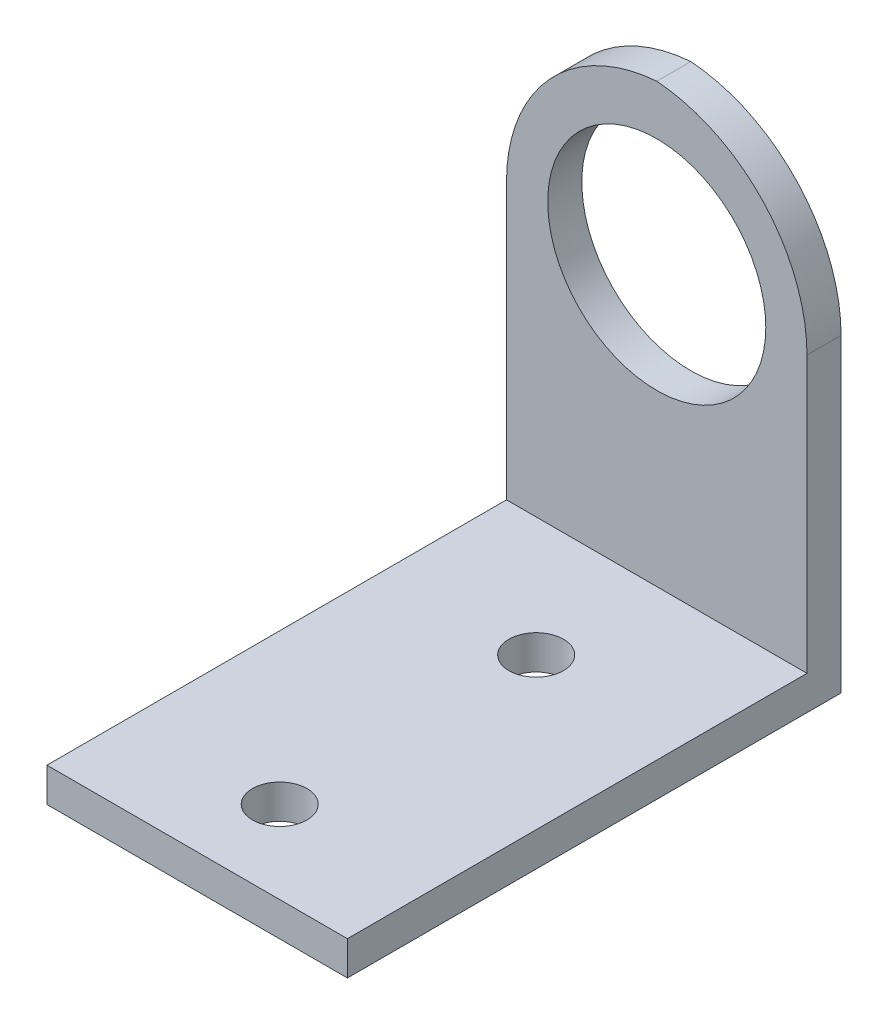
ISO-10303-21;
HEADER;
FILE_DESCRIPTION(('STEP AP214'),'2;1');
FILE_NAME('part.step','',(''),(''),'','','');
FILE_SCHEMA(('AUTOMOTIVE_DESIGN { 1 0 10303 214 1 1 1 1 }'));
ENDSEC;
DATA;
#1=APPLICATION_CONTEXT('core data for automotive mechanical design processes');
#2=APPLICATION_PROTOCOL_DEFINITION('international standard','automotive_design',2000,#1);
#3=PRODUCT_CONTEXT('',#1,'mechanical');
#4=PRODUCT('Part','Part','',(#3));
#5=PRODUCT_RELATED_PRODUCT_CATEGORY('part','',(#4));
#6=PRODUCT_DEFINITION_FORMATION('','',#4);
#7=PRODUCT_DEFINITION_CONTEXT('part definition',#1,'design');
#8=PRODUCT_DEFINITION('design','',#6,#7);
#9=PRODUCT_DEFINITION_SHAPE('','',#8);
#10=(LENGTH_UNIT() NAMED_UNIT(*) SI_UNIT(.MILLI.,.METRE.));
#11=(NAMED_UNIT(*) PLANE_ANGLE_UNIT() SI_UNIT($,.RADIAN.));
#12=(NAMED_UNIT(*) SI_UNIT($,.STERADIAN.) SOLID_ANGLE_UNIT());
#13=UNCERTAINTY_MEASURE_WITH_UNIT(LENGTH_MEASURE(1.E-05),#10,'distance_accuracy_value','');
#14=(GEOMETRIC_REPRESENTATION_CONTEXT(3) GLOBAL_UNCERTAINTY_ASSIGNED_CONTEXT((#13)) GLOBAL_UNIT_ASSIGNED_CONTEXT((#10,
#11,#12)) REPRESENTATION_CONTEXT('',''));
#15=CARTESIAN_POINT('',(0.,0.,0.));
#16=DIRECTION('',(0.,0.,1.));
#17=DIRECTION('',(1.,0.,0.));
#18=AXIS2_PLACEMENT_3D('',#15,#16,#17);
#19=CARTESIAN_POINT('',(-2.84600000000001,72.154,7.9375));
#20=DIRECTION('',(0.,0.,-1.));
#21=DIRECTION('',(-1.,0.,0.));
#22=AXIS2_PLACEMENT_3D('',#19,#20,#21);
#23=CYLINDRICAL_SURFACE('',#22,37.846);
#24=CARTESIAN_POINT('',(-2.84600000000001,72.154,0.));
#25=DIRECTION('',(0.,0.,1.));
#26=DIRECTION('',(1.,0.,0.));
#27=AXIS2_PLACEMENT_3D('',#24,#25,#26);
#28=CIRCLE('',#27,37.846);
#29=CARTESIAN_POINT('',(35.,72.154,0.));
#30=VERTEX_POINT('',#29);
#31=CARTESIAN_POINT('',(0.,109.892839409818,0.));
#32=VERTEX_POINT('',#31);
#33=EDGE_CURVE('E138',#30,#32,#28,.T.);
#34=ORIENTED_EDGE('',*,*,#33,.T.);
#35=DIRECTION('',(0.,0.,-1.));
#36=VECTOR('',#35,1.);
#37=CARTESIAN_POINT('',(0.,109.892839409818,7.9375));
#38=LINE('',#37,#36);
#39=CARTESIAN_POINT('',(0.,109.892839409818,7.9375));
#40=VERTEX_POINT('',#39);
#41=EDGE_CURVE('E11',#40,#32,#38,.T.);
#42=ORIENTED_EDGE('',*,*,#41,.F.);
#43=CARTESIAN_POINT('',(-2.84600000000001,72.154,7.9375));
#44=DIRECTION('',(0.,0.,1.));
#45=DIRECTION('',(1.,0.,0.));
#46=AXIS2_PLACEMENT_3D('',#43,#44,#45);
#47=CIRCLE('',#46,37.846);
#48=CARTESIAN_POINT('',(35.,72.154,7.9375));
#49=VERTEX_POINT('',#48);
#50=EDGE_CURVE('E127',#49,#40,#47,.T.);
#51=ORIENTED_EDGE('',*,*,#50,.F.);
#52=DIRECTION('',(0.,0.,-1.));
#53=VECTOR('',#52,1.);
#54=CARTESIAN_POINT('',(35.,72.154,7.9375));
#55=LINE('',#54,#53);
#56=EDGE_CURVE('E135',#49,#30,#55,.T.);
#57=ORIENTED_EDGE('',*,*,#56,.T.);
#58=EDGE_LOOP('',(#34,#42,#51,#57));
#59=FACE_BOUND('',#58,.T.);
#60=ADVANCED_FACE('F35',(#59),#23,.T.);
#61=CARTESIAN_POINT('',(2.84599999999999,72.1540000000001,7.9375));
#62=DIRECTION('',(0.,0.,-1.));
#63=DIRECTION('',(-1.,0.,0.));
#64=AXIS2_PLACEMENT_3D('',#61,#62,#63);
#65=CYLINDRICAL_SURFACE('',#64,37.846);
#66=CARTESIAN_POINT('',(2.84599999999999,72.1540000000001,0.));
#67=DIRECTION('',(0.,0.,1.));
#68=DIRECTION('',(1.,0.,0.));
#69=AXIS2_PLACEMENT_3D('',#66,#67,#68);
#70=CIRCLE('',#69,37.846);
#71=CARTESIAN_POINT('',(-35.,72.1540000000001,0.));
#72=VERTEX_POINT('',#71);
#73=EDGE_CURVE('E141',#32,#72,#70,.T.);
#74=ORIENTED_EDGE('',*,*,#73,.T.);
#75=DIRECTION('',(0.,0.,-1.));
#76=VECTOR('',#75,1.);
#77=CARTESIAN_POINT('',(-35.,72.1540000000001,7.9375));
#78=LINE('',#77,#76);
#79=CARTESIAN_POINT('',(-35.,72.1540000000001,7.9375));
#80=VERTEX_POINT('',#79);
#81=EDGE_CURVE('E43',#80,#72,#78,.T.);
#82=ORIENTED_EDGE('',*,*,#81,.F.);
#83=CARTESIAN_POINT('',(2.84599999999999,72.1540000000001,7.9375));
#84=DIRECTION('',(0.,0.,1.));
#85=DIRECTION('',(1.,0.,0.));
#86=AXIS2_PLACEMENT_3D('',#83,#84,#85);
#87=CIRCLE('',#86,37.846);
#88=EDGE_CURVE('E131',#40,#80,#87,.T.);
#89=ORIENTED_EDGE('',*,*,#88,.F.);
#90=ORIENTED_EDGE('',*,*,#41,.T.);
#91=EDGE_LOOP('',(#74,#82,#89,#90));
#92=FACE_BOUND('',#91,.T.);
#93=ADVANCED_FACE('F160',(#92),#65,.T.);
#94=CARTESIAN_POINT('',(-35.,0.,7.9375));
#95=DIRECTION('',(-1.,0.,0.));
#96=DIRECTION('',(0.,-1.,0.));
#97=AXIS2_PLACEMENT_3D('',#94,#95,#96);
#98=PLANE('',#97);
#99=ORIENTED_EDGE('',*,*,#81,.T.);
#100=DIRECTION('',(0.,1.,0.));
#101=VECTOR('',#100,1.);
#102=CARTESIAN_POINT('',(-35.,0.,0.));
#103=LINE('',#102,#101);
#104=CARTESIAN_POINT('',(-35.,0.,0.));
#105=VERTEX_POINT('',#104);
#106=EDGE_CURVE('E144',#105,#72,#103,.T.);
#107=ORIENTED_EDGE('',*,*,#106,.F.);
#108=DIRECTION('',(0.,0.,-1.));
#109=VECTOR('',#108,1.);
#110=CARTESIAN_POINT('',(-35.,0.,7.9375));
#111=LINE('',#110,#109);
#112=CARTESIAN_POINT('',(-35.,0.,115.));
#113=VERTEX_POINT('',#112);
#114=EDGE_CURVE('E153',#113,#105,#111,.T.);
#115=ORIENTED_EDGE('',*,*,#114,.F.);
#116=DIRECTION('',(0.,-1.,0.));
#117=VECTOR('',#116,1.);
#118=CARTESIAN_POINT('',(-35.,7.9375,115.));
#119=LINE('',#118,#117);
#120=CARTESIAN_POINT('',(-35.,7.9375,115.));
#121=VERTEX_POINT('',#120);
#122=EDGE_CURVE('E111',#121,#113,#119,.T.);
#123=ORIENTED_EDGE('',*,*,#122,.F.);
#124=DIRECTION('',(0.,0.,-1.));
#125=VECTOR('',#124,1.);
#126=CARTESIAN_POINT('',(-35.,7.9375,0.));
#127=LINE('',#126,#125);
#128=CARTESIAN_POINT('',(-35.,7.9375,7.9375));
#129=VERTEX_POINT('',#128);
#130=EDGE_CURVE('E103',#121,#129,#127,.T.);
#131=ORIENTED_EDGE('',*,*,#130,.T.);
#132=DIRECTION('',(0.,1.,0.));
#133=VECTOR('',#132,1.);
#134=CARTESIAN_POINT('',(-35.,0.,7.9375));
#135=LINE('',#134,#133);
#136=EDGE_CURVE('E55',#129,#80,#135,.T.);
#137=ORIENTED_EDGE('',*,*,#136,.T.);
#138=EDGE_LOOP('',(#99,#107,#115,#123,#131,#137));
#139=FACE_BOUND('',#138,.T.);
#140=ADVANCED_FACE('F158',(#139),#98,.T.);
#141=CARTESIAN_POINT('',(0.,0.,7.9375));
#142=DIRECTION('',(0.,1.,0.));
#143=DIRECTION('',(-1.,0.,0.));
#144=AXIS2_PLACEMENT_3D('',#141,#142,#143);
#145=PLANE('',#144);
#146=DIRECTION('',(1.,0.,0.));
#147=VECTOR('',#146,1.);
#148=CARTESIAN_POINT('',(0.,0.,0.));
#149=LINE('',#148,#147);
#150=CARTESIAN_POINT('',(35.,0.,0.));
#151=VERTEX_POINT('',#150);
#152=EDGE_CURVE('E146',#105,#151,#149,.T.);
#153=ORIENTED_EDGE('',*,*,#152,.T.);
#154=DIRECTION('',(0.,0.,-1.));
#155=VECTOR('',#154,1.);
#156=CARTESIAN_POINT('',(35.,0.,7.9375));
#157=LINE('',#156,#155);
#158=CARTESIAN_POINT('',(35.,0.,115.));
#159=VERTEX_POINT('',#158);
#160=EDGE_CURVE('E151',#159,#151,#157,.T.);
#161=ORIENTED_EDGE('',*,*,#160,.F.);
#162=DIRECTION('',(-1.,0.,0.));
#163=VECTOR('',#162,1.);
#164=CARTESIAN_POINT('',(-35.,0.,115.));
#165=LINE('',#164,#163);
#166=EDGE_CURVE('E110',#159,#113,#165,.T.);
#167=ORIENTED_EDGE('',*,*,#166,.T.);
#168=ORIENTED_EDGE('',*,*,#114,.T.);
#169=EDGE_LOOP('',(#153,#161,#167,#168));
#170=FACE_BOUND('',#169,.T.);
#171=CARTESIAN_POINT('',(0.,0.,95.772581168555));
#172=DIRECTION('',(0.,-1.,0.));
#173=DIRECTION('',(0.,0.,-1.));
#174=AXIS2_PLACEMENT_3D('',#171,#172,#173);
#175=CIRCLE('',#174,6.35);
#176=CARTESIAN_POINT('',(0.,0.,89.422581168555));
#177=VERTEX_POINT('',#176);
#178=EDGE_CURVE('E259',#177,#177,#175,.T.);
#179=ORIENTED_EDGE('',*,*,#178,.F.);
#180=EDGE_LOOP('',(#179));
#181=FACE_BOUND('',#180,.T.);
#182=CARTESIAN_POINT('',(-0.253999999999734,0.,35.772581168555));
#183=DIRECTION('',(0.,-1.,0.));
#184=DIRECTION('',(0.,0.,-1.));
#185=AXIS2_PLACEMENT_3D('',#182,#183,#184);
#186=CIRCLE('',#185,6.35);
#187=CARTESIAN_POINT('',(-0.253999999999734,0.,29.422581168555));
#188=VERTEX_POINT('',#187);
#189=EDGE_CURVE('E261',#188,#188,#186,.T.);
#190=ORIENTED_EDGE('',*,*,#189,.F.);
#191=EDGE_LOOP('',(#190));
#192=FACE_BOUND('',#191,.T.);
#193=ADVANCED_FACE('F168',(#170,#181,#192),#145,.F.);
#194=CARTESIAN_POINT('',(0.,72.9,7.9375));
#195=DIRECTION('',(0.,0.,-1.));
#196=DIRECTION('',(-1.,0.,0.));
#197=AXIS2_PLACEMENT_3D('',#194,#195,#196);
#198=CYLINDRICAL_SURFACE('',#197,25.4);
#199=CARTESIAN_POINT('',(0.,72.9,7.9375));
#200=DIRECTION('',(0.,0.,1.));
#201=DIRECTION('',(1.,0.,0.));
#202=AXIS2_PLACEMENT_3D('',#199,#200,#201);
#203=CIRCLE('',#202,25.4);
#204=CARTESIAN_POINT('',(25.4,72.9,7.9375));
#205=VERTEX_POINT('',#204);
#206=EDGE_CURVE('E124',#205,#205,#203,.T.);
#207=ORIENTED_EDGE('',*,*,#206,.T.);
#208=EDGE_LOOP('',(#207));
#209=FACE_BOUND('',#208,.T.);
#210=CARTESIAN_POINT('',(0.,72.9,0.));
#211=DIRECTION('',(0.,0.,1.));
#212=DIRECTION('',(1.,0.,0.));
#213=AXIS2_PLACEMENT_3D('',#210,#211,#212);
#214=CIRCLE('',#213,25.4);
#215=CARTESIAN_POINT('',(25.4,72.9,0.));
#216=VERTEX_POINT('',#215);
#217=EDGE_CURVE('E123',#216,#216,#214,.T.);
#218=ORIENTED_EDGE('',*,*,#217,.F.);
#219=EDGE_LOOP('',(#218));
#220=FACE_BOUND('',#219,.T.);
#221=ADVANCED_FACE('F37',(#209,#220),#198,.F.);
#222=CARTESIAN_POINT('',(35.,0.,7.9375));
#223=DIRECTION('',(-1.,0.,0.));
#224=DIRECTION('',(0.,-1.,0.));
#225=AXIS2_PLACEMENT_3D('',#222,#223,#224);
#226=PLANE('',#225);
#227=DIRECTION('',(0.,1.,0.));
#228=VECTOR('',#227,1.);
#229=CARTESIAN_POINT('',(35.,0.,7.9375));
#230=LINE('',#229,#228);
#231=CARTESIAN_POINT('',(35.,7.9375,7.9375));
#232=VERTEX_POINT('',#231);
#233=EDGE_CURVE('E99',#232,#49,#230,.T.);
#234=ORIENTED_EDGE('',*,*,#233,.F.);
#235=DIRECTION('',(0.,0.,1.));
#236=VECTOR('',#235,1.);
#237=CARTESIAN_POINT('',(35.,7.9375,0.));
#238=LINE('',#237,#236);
#239=CARTESIAN_POINT('',(35.,7.9375,115.));
#240=VERTEX_POINT('',#239);
#241=EDGE_CURVE('E92',#232,#240,#238,.T.);
#242=ORIENTED_EDGE('',*,*,#241,.T.);
#243=DIRECTION('',(0.,-1.,0.));
#244=VECTOR('',#243,1.);
#245=CARTESIAN_POINT('',(35.,7.9375,115.));
#246=LINE('',#245,#244);
#247=EDGE_CURVE('E96',#240,#159,#246,.T.);
#248=ORIENTED_EDGE('',*,*,#247,.T.);
#249=ORIENTED_EDGE('',*,*,#160,.T.);
#250=DIRECTION('',(0.,1.,0.));
#251=VECTOR('',#250,1.);
#252=CARTESIAN_POINT('',(35.,0.,0.));
#253=LINE('',#252,#251);
#254=EDGE_CURVE('E128',#151,#30,#253,.T.);
#255=ORIENTED_EDGE('',*,*,#254,.T.);
#256=ORIENTED_EDGE('',*,*,#56,.F.);
#257=EDGE_LOOP('',(#234,#242,#248,#249,#255,#256));
#258=FACE_BOUND('',#257,.T.);
#259=ADVANCED_FACE('F94',(#258),#226,.F.);
#260=CARTESIAN_POINT('',(0.,0.,7.9375));
#261=DIRECTION('',(0.,0.,1.));
#262=DIRECTION('',(1.,0.,0.));
#263=AXIS2_PLACEMENT_3D('',#260,#261,#262);
#264=PLANE('',#263);
#265=DIRECTION('',(-1.,0.,0.));
#266=VECTOR('',#265,1.);
#267=CARTESIAN_POINT('',(0.,7.9375,7.9375));
#268=LINE('',#267,#266);
#269=EDGE_CURVE('E50',#232,#129,#268,.T.);
#270=ORIENTED_EDGE('',*,*,#269,.F.);
#271=ORIENTED_EDGE('',*,*,#233,.T.);
#272=ORIENTED_EDGE('',*,*,#50,.T.);
#273=ORIENTED_EDGE('',*,*,#88,.T.);
#274=ORIENTED_EDGE('',*,*,#136,.F.);
#275=EDGE_LOOP('',(#270,#271,#272,#273,#274));
#276=FACE_BOUND('',#275,.T.);
#277=ORIENTED_EDGE('',*,*,#206,.F.);
#278=EDGE_LOOP('',(#277));
#279=FACE_BOUND('',#278,.T.);
#280=ADVANCED_FACE('F172',(#276,#279),#264,.T.);
#281=CARTESIAN_POINT('',(0.,0.,0.));
#282=DIRECTION('',(0.,0.,1.));
#283=DIRECTION('',(1.,0.,0.));
#284=AXIS2_PLACEMENT_3D('',#281,#282,#283);
#285=PLANE('',#284);
#286=ORIENTED_EDGE('',*,*,#217,.T.);
#287=EDGE_LOOP('',(#286));
#288=FACE_BOUND('',#287,.T.);
#289=ORIENTED_EDGE('',*,*,#33,.F.);
#290=ORIENTED_EDGE('',*,*,#254,.F.);
#291=ORIENTED_EDGE('',*,*,#152,.F.);
#292=ORIENTED_EDGE('',*,*,#106,.T.);
#293=ORIENTED_EDGE('',*,*,#73,.F.);
#294=EDGE_LOOP('',(#289,#290,#291,#292,#293));
#295=FACE_BOUND('',#294,.T.);
#296=ADVANCED_FACE('F164',(#288,#295),#285,.F.);
#297=CARTESIAN_POINT('',(-35.,7.9375,115.));
#298=DIRECTION('',(0.,0.,1.));
#299=DIRECTION('',(1.,0.,0.));
#300=AXIS2_PLACEMENT_3D('',#297,#298,#299);
#301=PLANE('',#300);
#302=ORIENTED_EDGE('',*,*,#166,.F.);
#303=ORIENTED_EDGE('',*,*,#247,.F.);
#304=DIRECTION('',(-1.,0.,0.));
#305=VECTOR('',#304,1.);
#306=CARTESIAN_POINT('',(-35.,7.9375,115.));
#307=LINE('',#306,#305);
#308=EDGE_CURVE('E102',#240,#121,#307,.T.);
#309=ORIENTED_EDGE('',*,*,#308,.T.);
#310=ORIENTED_EDGE('',*,*,#122,.T.);
#311=EDGE_LOOP('',(#302,#303,#309,#310));
#312=FACE_BOUND('',#311,.T.);
#313=ADVANCED_FACE('F107',(#312),#301,.T.);
#314=CARTESIAN_POINT('',(0.,7.9375,0.));
#315=DIRECTION('',(0.,1.,0.));
#316=DIRECTION('',(0.,0.,1.));
#317=AXIS2_PLACEMENT_3D('',#314,#315,#316);
#318=PLANE('',#317);
#319=CARTESIAN_POINT('',(0.,7.9375,95.772581168555));
#320=DIRECTION('',(0.,-1.,0.));
#321=DIRECTION('',(0.,0.,-1.));
#322=AXIS2_PLACEMENT_3D('',#319,#320,#321);
#323=CIRCLE('',#322,6.35);
#324=CARTESIAN_POINT('',(0.,7.9375,89.422581168555));
#325=VERTEX_POINT('',#324);
#326=EDGE_CURVE('E256',#325,#325,#323,.T.);
#327=ORIENTED_EDGE('',*,*,#326,.T.);
#328=EDGE_LOOP('',(#327));
#329=FACE_BOUND('',#328,.T.);
#330=CARTESIAN_POINT('',(-0.253999999999734,7.9375,35.772581168555));
#331=DIRECTION('',(0.,-1.,0.));
#332=DIRECTION('',(0.,0.,-1.));
#333=AXIS2_PLACEMENT_3D('',#330,#331,#332);
#334=CIRCLE('',#333,6.35);
#335=CARTESIAN_POINT('',(-0.253999999999734,7.9375,29.422581168555));
#336=VERTEX_POINT('',#335);
#337=EDGE_CURVE('E120',#336,#336,#334,.T.);
#338=ORIENTED_EDGE('',*,*,#337,.T.);
#339=EDGE_LOOP('',(#338));
#340=FACE_BOUND('',#339,.T.);
#341=ORIENTED_EDGE('',*,*,#241,.F.);
#342=ORIENTED_EDGE('',*,*,#269,.T.);
#343=ORIENTED_EDGE('',*,*,#130,.F.);
#344=ORIENTED_EDGE('',*,*,#308,.F.);
#345=EDGE_LOOP('',(#341,#342,#343,#344));
#346=FACE_BOUND('',#345,.T.);
#347=ADVANCED_FACE('F114',(#329,#340,#346),#318,.T.);
#348=CARTESIAN_POINT('',(-0.253999999999734,7.9375,35.772581168555));
#349=DIRECTION('',(0.,-1.,0.));
#350=DIRECTION('',(0.,0.,-1.));
#351=AXIS2_PLACEMENT_3D('',#348,#349,#350);
#352=CYLINDRICAL_SURFACE('',#351,6.35);
#353=ORIENTED_EDGE('',*,*,#337,.F.);
#354=EDGE_LOOP('',(#353));
#355=FACE_BOUND('',#354,.T.);
#356=ORIENTED_EDGE('',*,*,#189,.T.);
#357=EDGE_LOOP('',(#356));
#358=FACE_BOUND('',#357,.T.);
#359=ADVANCED_FACE('F229',(#355,#358),#352,.F.);
#360=CARTESIAN_POINT('',(0.,7.9375,95.772581168555));
#361=DIRECTION('',(0.,-1.,0.));
#362=DIRECTION('',(0.,0.,-1.));
#363=AXIS2_PLACEMENT_3D('',#360,#361,#362);
#364=CYLINDRICAL_SURFACE('',#363,6.35);
#365=ORIENTED_EDGE('',*,*,#326,.F.);
#366=EDGE_LOOP('',(#365));
#367=FACE_BOUND('',#366,.T.);
#368=ORIENTED_EDGE('',*,*,#178,.T.);
#369=EDGE_LOOP('',(#368));
#370=FACE_BOUND('',#369,.T.);
#371=ADVANCED_FACE('F239',(#367,#370),#364,.F.);
#372=CLOSED_SHELL('',(#60,#93,#140,#193,#221,#259,#280,#296,#313,#347,#359,#371));
#373=MANIFOLD_SOLID_BREP('B2',#372);
#374=ADVANCED_BREP_SHAPE_REPRESENTATION('',(#18,#373),#14);
#375=SHAPE_DEFINITION_REPRESENTATION(#9,#374);
ENDSEC;
END-ISO-10303-21;
